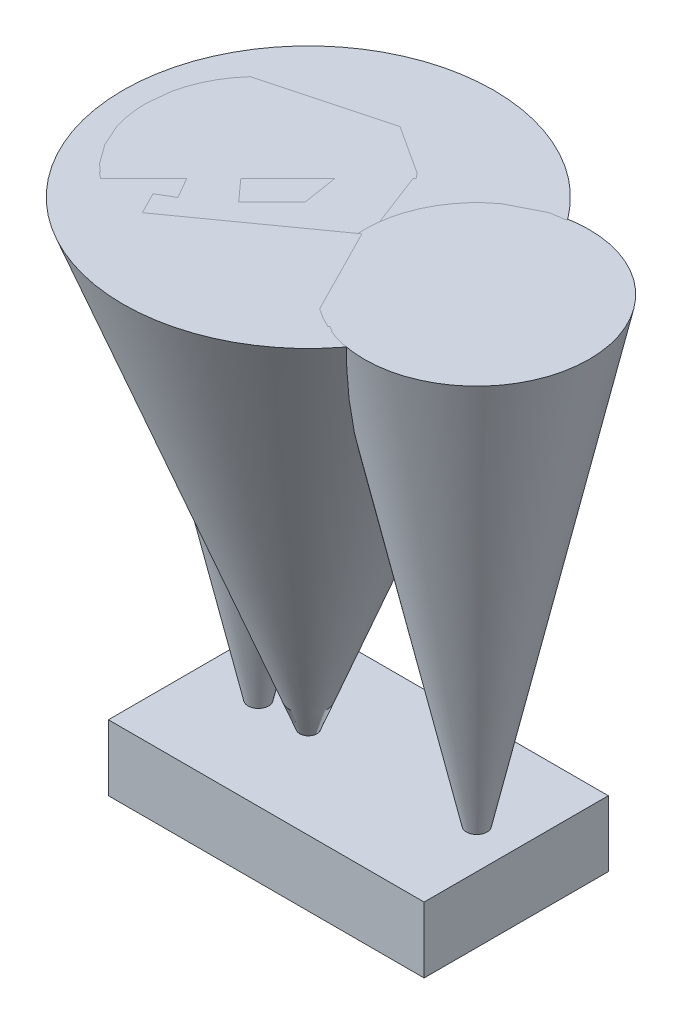
ISO-10303-21;
HEADER;
FILE_DESCRIPTION(('STEP AP214'),'2;1');
FILE_NAME('part.step','',(''),(''),'','','');
FILE_SCHEMA(('AUTOMOTIVE_DESIGN { 1 0 10303 214 1 1 1 1 }'));
ENDSEC;
DATA;
#1=APPLICATION_CONTEXT('core data for automotive mechanical design processes');
#2=APPLICATION_PROTOCOL_DEFINITION('international standard','automotive_design',2000,#1);
#3=PRODUCT_CONTEXT('',#1,'mechanical');
#4=PRODUCT('Part','Part','',(#3));
#5=PRODUCT_RELATED_PRODUCT_CATEGORY('part','',(#4));
#6=PRODUCT_DEFINITION_FORMATION('','',#4);
#7=PRODUCT_DEFINITION_CONTEXT('part definition',#1,'design');
#8=PRODUCT_DEFINITION('design','',#6,#7);
#9=PRODUCT_DEFINITION_SHAPE('','',#8);
#10=(LENGTH_UNIT() NAMED_UNIT(*) SI_UNIT(.MILLI.,.METRE.));
#11=(NAMED_UNIT(*) PLANE_ANGLE_UNIT() SI_UNIT($,.RADIAN.));
#12=(NAMED_UNIT(*) SI_UNIT($,.STERADIAN.) SOLID_ANGLE_UNIT());
#13=UNCERTAINTY_MEASURE_WITH_UNIT(LENGTH_MEASURE(1.E-05),#10,'distance_accuracy_value','');
#14=(GEOMETRIC_REPRESENTATION_CONTEXT(3) GLOBAL_UNCERTAINTY_ASSIGNED_CONTEXT((#13)) GLOBAL_UNIT_ASSIGNED_CONTEXT((#10,
#11,#12)) REPRESENTATION_CONTEXT('',''));
#15=CARTESIAN_POINT('',(0.,0.,0.));
#16=DIRECTION('',(0.,0.,1.));
#17=DIRECTION('',(1.,0.,0.));
#18=AXIS2_PLACEMENT_3D('',#15,#16,#17);
#19=CARTESIAN_POINT('',(0.0907341510229254,8.00000000000001,0.));
#20=DIRECTION('',(0.,-1.,0.));
#21=DIRECTION('',(1.,0.,0.));
#22=AXIS2_PLACEMENT_3D('',#19,#20,#21);
#23=PLANE('',#22);
#24=CARTESIAN_POINT('',(1.8,7.99999999998136,0.));
#25=DIRECTION('',(0.,1.,0.));
#26=DIRECTION('',(-1.,0.,0.));
#27=AXIS2_PLACEMENT_3D('',#24,#25,#26);
#28=CIRCLE('',#27,1.7092658489685);
#29=CARTESIAN_POINT('',(0.0907341510315005,7.99999999998136,0.));
#30=VERTEX_POINT('',#29);
#31=EDGE_CURVE('P0_E11',#30,#30,#28,.F.);
#32=ORIENTED_EDGE('',*,*,#31,.F.);
#33=EDGE_LOOP('',(#32));
#34=FACE_BOUND('',#33,.T.);
#35=ADVANCED_FACE('P0_F16',(#34),#23,.F.);
#36=CARTESIAN_POINT('',(1.8,7.99999999992451,0.));
#37=DIRECTION('',(0.,1.,0.));
#38=DIRECTION('',(-1.,0.,0.));
#39=AXIS2_PLACEMENT_3D('',#36,#37,#38);
#40=CONICAL_SURFACE('',#39,1.7092658489559,0.218166156463864);
#41=CARTESIAN_POINT('',(1.80000000014502,0.289999999381507,0.));
#42=VERTEX_POINT('',#41);
#43=VERTEX_LOOP('',#42);
#44=FACE_BOUND('',#43,.T.);
#45=ORIENTED_EDGE('',*,*,#31,.T.);
#46=EDGE_LOOP('',(#45));
#47=FACE_BOUND('',#46,.T.);
#48=ADVANCED_FACE('P0_F23',(#44,#47),#40,.T.);
#49=CLOSED_SHELL('',(#35,#48));
#50=MANIFOLD_SOLID_BREP('P0_B1',#49);
#51=CARTESIAN_POINT('',(-3.22926584897707,8.00000000000001,0.));
#52=DIRECTION('',(0.,-1.,0.));
#53=DIRECTION('',(1.,0.,0.));
#54=AXIS2_PLACEMENT_3D('',#51,#52,#53);
#55=PLANE('',#54);
#56=CARTESIAN_POINT('',(-1.52,7.99999999998136,0.));
#57=DIRECTION('',(0.,1.,0.));
#58=DIRECTION('',(0.,0.,1.));
#59=AXIS2_PLACEMENT_3D('',#56,#57,#58);
#60=CIRCLE('',#59,1.7092658489691);
#61=CARTESIAN_POINT('',(-1.52,7.99999999998136,1.7092658489691));
#62=VERTEX_POINT('',#61);
#63=EDGE_CURVE('P1_E11',#62,#62,#60,.F.);
#64=ORIENTED_EDGE('',*,*,#63,.F.);
#65=EDGE_LOOP('',(#64));
#66=FACE_BOUND('',#65,.T.);
#67=ADVANCED_FACE('P1_F16',(#66),#55,.F.);
#68=CARTESIAN_POINT('',(-1.52,7.99999999986767,0.));
#69=DIRECTION('',(0.,1.,0.));
#70=DIRECTION('',(0.,0.,1.));
#71=AXIS2_PLACEMENT_3D('',#68,#69,#70);
#72=CONICAL_SURFACE('',#71,1.7092658489439,0.21816615644608);
#73=CARTESIAN_POINT('',(-1.51999999981456,0.289999999154134,0.));
#74=VERTEX_POINT('',#73);
#75=VERTEX_LOOP('',#74);
#76=FACE_BOUND('',#75,.T.);
#77=ORIENTED_EDGE('',*,*,#63,.T.);
#78=EDGE_LOOP('',(#77));
#79=FACE_BOUND('',#78,.T.);
#80=ADVANCED_FACE('P1_F23',(#76,#79),#72,.T.);
#81=CLOSED_SHELL('',(#67,#80));
#82=MANIFOLD_SOLID_BREP('P1_B1',#81);
#83=CARTESIAN_POINT('',(0.,0.,0.));
#84=DIRECTION('',(0.,-1.,0.));
#85=DIRECTION('',(0.,0.,-1.));
#86=AXIS2_PLACEMENT_3D('',#83,#84,#85);
#87=PLANE('',#86);
#88=DIRECTION('',(0.,0.,-1.));
#89=VECTOR('',#88,1.);
#90=CARTESIAN_POINT('',(-2.4,0.,1.4));
#91=LINE('',#90,#89);
#92=CARTESIAN_POINT('',(-2.4,0.,1.4));
#93=VERTEX_POINT('',#92);
#94=CARTESIAN_POINT('',(-2.4,0.,-1.4));
#95=VERTEX_POINT('',#94);
#96=EDGE_CURVE('P2_E54',#93,#95,#91,.T.);
#97=ORIENTED_EDGE('',*,*,#96,.T.);
#98=DIRECTION('',(1.,0.,0.));
#99=VECTOR('',#98,1.);
#100=CARTESIAN_POINT('',(-2.4,0.,-1.4));
#101=LINE('',#100,#99);
#102=CARTESIAN_POINT('',(2.4,0.,-1.4));
#103=VERTEX_POINT('',#102);
#104=EDGE_CURVE('P2_E75',#95,#103,#101,.T.);
#105=ORIENTED_EDGE('',*,*,#104,.T.);
#106=DIRECTION('',(0.,0.,1.));
#107=VECTOR('',#106,1.);
#108=CARTESIAN_POINT('',(2.4,0.,1.4));
#109=LINE('',#108,#107);
#110=CARTESIAN_POINT('',(2.4,0.,1.4));
#111=VERTEX_POINT('',#110);
#112=EDGE_CURVE('P2_E57',#103,#111,#109,.T.);
#113=ORIENTED_EDGE('',*,*,#112,.T.);
#114=DIRECTION('',(-1.,0.,0.));
#115=VECTOR('',#114,1.);
#116=CARTESIAN_POINT('',(-2.4,0.,1.4));
#117=LINE('',#116,#115);
#118=EDGE_CURVE('P2_E19',#111,#93,#117,.T.);
#119=ORIENTED_EDGE('',*,*,#118,.T.);
#120=EDGE_LOOP('',(#97,#105,#113,#119));
#121=FACE_BOUND('',#120,.T.);
#122=ADVANCED_FACE('P2_F16',(#121),#87,.T.);
#123=CARTESIAN_POINT('',(-2.4,1.,1.4));
#124=DIRECTION('',(0.,0.,-1.));
#125=DIRECTION('',(-1.,0.,0.));
#126=AXIS2_PLACEMENT_3D('',#123,#124,#125);
#127=PLANE('',#126);
#128=DIRECTION('',(0.,1.,0.));
#129=VECTOR('',#128,1.);
#130=CARTESIAN_POINT('',(2.4,1.,1.4));
#131=LINE('',#130,#129);
#132=CARTESIAN_POINT('',(2.4,1.,1.4));
#133=VERTEX_POINT('',#132);
#134=EDGE_CURVE('P2_E77',#111,#133,#131,.T.);
#135=ORIENTED_EDGE('',*,*,#134,.T.);
#136=DIRECTION('',(1.,0.,0.));
#137=VECTOR('',#136,1.);
#138=CARTESIAN_POINT('',(0.,1.,1.4));
#139=LINE('',#138,#137);
#140=CARTESIAN_POINT('',(-2.4,1.,1.4));
#141=VERTEX_POINT('',#140);
#142=EDGE_CURVE('P2_E72',#133,#141,#139,.F.);
#143=ORIENTED_EDGE('',*,*,#142,.T.);
#144=DIRECTION('',(0.,1.,0.));
#145=VECTOR('',#144,1.);
#146=CARTESIAN_POINT('',(-2.4,1.,1.4));
#147=LINE('',#146,#145);
#148=EDGE_CURVE('P2_E62',#141,#93,#147,.F.);
#149=ORIENTED_EDGE('',*,*,#148,.T.);
#150=ORIENTED_EDGE('',*,*,#118,.F.);
#151=EDGE_LOOP('',(#135,#143,#149,#150));
#152=FACE_BOUND('',#151,.T.);
#153=ADVANCED_FACE('P2_F71',(#152),#127,.F.);
#154=CARTESIAN_POINT('',(-2.4,1.,1.4));
#155=DIRECTION('',(1.,0.,0.));
#156=DIRECTION('',(0.,0.,-1.));
#157=AXIS2_PLACEMENT_3D('',#154,#155,#156);
#158=PLANE('',#157);
#159=ORIENTED_EDGE('',*,*,#148,.F.);
#160=DIRECTION('',(0.,0.,-1.));
#161=VECTOR('',#160,1.);
#162=CARTESIAN_POINT('',(-2.4,1.,0.));
#163=LINE('',#162,#161);
#164=CARTESIAN_POINT('',(-2.4,1.,-1.4));
#165=VERTEX_POINT('',#164);
#166=EDGE_CURVE('P2_E82',#141,#165,#163,.T.);
#167=ORIENTED_EDGE('',*,*,#166,.T.);
#168=DIRECTION('',(0.,1.,0.));
#169=VECTOR('',#168,1.);
#170=CARTESIAN_POINT('',(-2.4,1.,-1.4));
#171=LINE('',#170,#169);
#172=EDGE_CURVE('P2_E68',#165,#95,#171,.F.);
#173=ORIENTED_EDGE('',*,*,#172,.T.);
#174=ORIENTED_EDGE('',*,*,#96,.F.);
#175=EDGE_LOOP('',(#159,#167,#173,#174));
#176=FACE_BOUND('',#175,.T.);
#177=ADVANCED_FACE('P2_F65',(#176),#158,.F.);
#178=CARTESIAN_POINT('',(-2.4,1.,-1.4));
#179=DIRECTION('',(0.,0.,1.));
#180=DIRECTION('',(1.,0.,0.));
#181=AXIS2_PLACEMENT_3D('',#178,#179,#180);
#182=PLANE('',#181);
#183=ORIENTED_EDGE('',*,*,#172,.F.);
#184=DIRECTION('',(1.,0.,0.));
#185=VECTOR('',#184,1.);
#186=CARTESIAN_POINT('',(0.,1.,-1.4));
#187=LINE('',#186,#185);
#188=CARTESIAN_POINT('',(2.4,1.,-1.4));
#189=VERTEX_POINT('',#188);
#190=EDGE_CURVE('P2_E25',#165,#189,#187,.T.);
#191=ORIENTED_EDGE('',*,*,#190,.T.);
#192=DIRECTION('',(0.,1.,0.));
#193=VECTOR('',#192,1.);
#194=CARTESIAN_POINT('',(2.4,1.,-1.4));
#195=LINE('',#194,#193);
#196=EDGE_CURVE('P2_E33',#189,#103,#195,.F.);
#197=ORIENTED_EDGE('',*,*,#196,.T.);
#198=ORIENTED_EDGE('',*,*,#104,.F.);
#199=EDGE_LOOP('',(#183,#191,#197,#198));
#200=FACE_BOUND('',#199,.T.);
#201=ADVANCED_FACE('P2_F87',(#200),#182,.F.);
#202=CARTESIAN_POINT('',(2.4,1.,1.4));
#203=DIRECTION('',(-1.,0.,0.));
#204=DIRECTION('',(0.,0.,1.));
#205=AXIS2_PLACEMENT_3D('',#202,#203,#204);
#206=PLANE('',#205);
#207=ORIENTED_EDGE('',*,*,#196,.F.);
#208=DIRECTION('',(0.,0.,-1.));
#209=VECTOR('',#208,1.);
#210=CARTESIAN_POINT('',(2.4,1.,0.));
#211=LINE('',#210,#209);
#212=EDGE_CURVE('P2_E11',#189,#133,#211,.F.);
#213=ORIENTED_EDGE('',*,*,#212,.T.);
#214=ORIENTED_EDGE('',*,*,#134,.F.);
#215=ORIENTED_EDGE('',*,*,#112,.F.);
#216=EDGE_LOOP('',(#207,#213,#214,#215));
#217=FACE_BOUND('',#216,.T.);
#218=ADVANCED_FACE('P2_F90',(#217),#206,.F.);
#219=CARTESIAN_POINT('',(0.,1.,0.));
#220=DIRECTION('',(0.,-1.,0.));
#221=DIRECTION('',(0.,0.,-1.));
#222=AXIS2_PLACEMENT_3D('',#219,#220,#221);
#223=PLANE('',#222);
#224=ORIENTED_EDGE('',*,*,#190,.F.);
#225=ORIENTED_EDGE('',*,*,#166,.F.);
#226=ORIENTED_EDGE('',*,*,#142,.F.);
#227=ORIENTED_EDGE('',*,*,#212,.F.);
#228=EDGE_LOOP('',(#224,#225,#226,#227));
#229=FACE_BOUND('',#228,.T.);
#230=ADVANCED_FACE('P2_F89',(#229),#223,.F.);
#231=CLOSED_SHELL('',(#122,#153,#177,#201,#218,#230));
#232=MANIFOLD_SOLID_BREP('P2_B1',#231);
#233=CARTESIAN_POINT('',(2.05756201715996,8.00000000000001,0.));
#234=DIRECTION('',(0.,1.,0.));
#235=DIRECTION('',(-1.,0.,0.));
#236=AXIS2_PLACEMENT_3D('',#233,#234,#235);
#237=PLANE('',#236);
#238=CARTESIAN_POINT('',(-0.759999999999999,7.9999999999999,0.));
#239=DIRECTION('',(0.,1.,0.));
#240=DIRECTION('',(-1.,0.,0.));
#241=AXIS2_PLACEMENT_3D('',#238,#239,#240);
#242=CIRCLE('',#241,2.81756201716);
#243=CARTESIAN_POINT('',(-3.57756201716,7.9999999999999,0.));
#244=VERTEX_POINT('',#243);
#245=EDGE_CURVE('P3_E11',#244,#244,#242,.F.);
#246=ORIENTED_EDGE('',*,*,#245,.F.);
#247=EDGE_LOOP('',(#246));
#248=FACE_BOUND('',#247,.T.);
#249=ADVANCED_FACE('P3_F16',(#248),#237,.T.);
#250=CARTESIAN_POINT('',(-0.759999999999999,7.99999999999967,0.));
#251=DIRECTION('',(0.,1.,0.));
#252=DIRECTION('',(-1.,0.,0.));
#253=AXIS2_PLACEMENT_3D('',#250,#251,#252);
#254=CONICAL_SURFACE('',#253,2.81756201715992,0.366519142918812);
#255=CARTESIAN_POINT('',(-0.76000000000026,0.660000000000438,0.));
#256=VERTEX_POINT('',#255);
#257=VERTEX_LOOP('',#256);
#258=FACE_BOUND('',#257,.T.);
#259=ORIENTED_EDGE('',*,*,#245,.T.);
#260=EDGE_LOOP('',(#259));
#261=FACE_BOUND('',#260,.T.);
#262=ADVANCED_FACE('P3_F23',(#258,#261),#254,.T.);
#263=CLOSED_SHELL('',(#249,#262));
#264=MANIFOLD_SOLID_BREP('P3_B1',#263);
#265=ADVANCED_BREP_SHAPE_REPRESENTATION('',(#18,#50,#82,#232,#264),#14);
#266=SHAPE_DEFINITION_REPRESENTATION(#9,#265);
ENDSEC;
END-ISO-10303-21;
